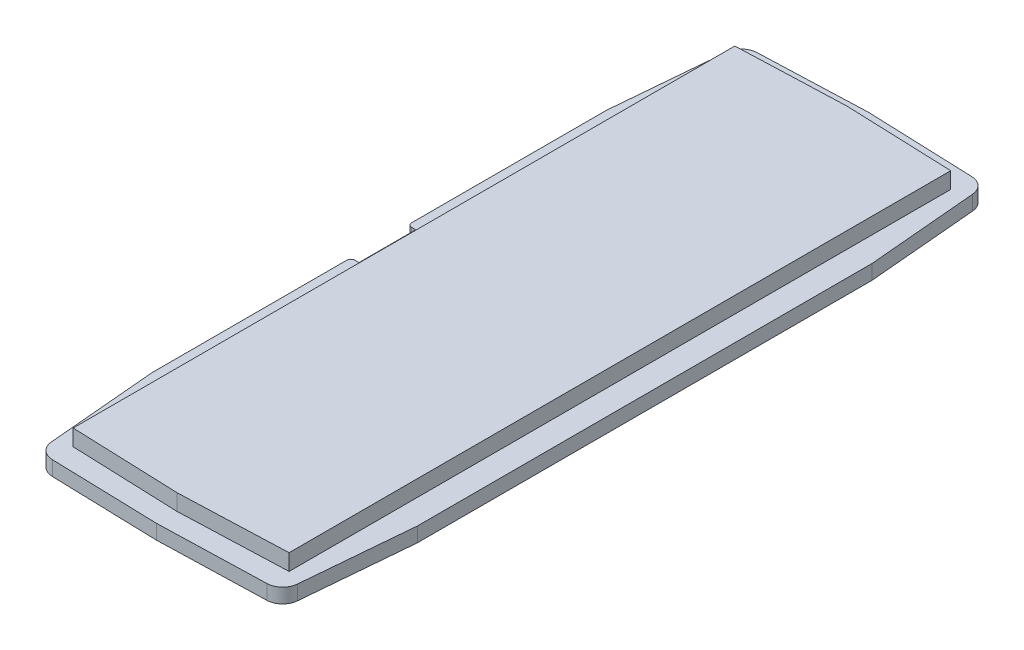
ISO-10303-21;
HEADER;
FILE_DESCRIPTION(('STEP AP214'),'2;1');
FILE_NAME('part.step','',(''),(''),'','','');
FILE_SCHEMA(('AUTOMOTIVE_DESIGN { 1 0 10303 214 1 1 1 1 }'));
ENDSEC;
DATA;
#1=APPLICATION_CONTEXT('core data for automotive mechanical design processes');
#2=APPLICATION_PROTOCOL_DEFINITION('international standard','automotive_design',2000,#1);
#3=PRODUCT_CONTEXT('',#1,'mechanical');
#4=PRODUCT('Part','Part','',(#3));
#5=PRODUCT_RELATED_PRODUCT_CATEGORY('part','',(#4));
#6=PRODUCT_DEFINITION_FORMATION('','',#4);
#7=PRODUCT_DEFINITION_CONTEXT('part definition',#1,'design');
#8=PRODUCT_DEFINITION('design','',#6,#7);
#9=PRODUCT_DEFINITION_SHAPE('','',#8);
#10=(LENGTH_UNIT() NAMED_UNIT(*) SI_UNIT(.MILLI.,.METRE.));
#11=(NAMED_UNIT(*) PLANE_ANGLE_UNIT() SI_UNIT($,.RADIAN.));
#12=(NAMED_UNIT(*) SI_UNIT($,.STERADIAN.) SOLID_ANGLE_UNIT());
#13=UNCERTAINTY_MEASURE_WITH_UNIT(LENGTH_MEASURE(1.E-05),#10,'distance_accuracy_value','');
#14=(GEOMETRIC_REPRESENTATION_CONTEXT(3) GLOBAL_UNCERTAINTY_ASSIGNED_CONTEXT((#13)) GLOBAL_UNIT_ASSIGNED_CONTEXT((#10,
#11,#12)) REPRESENTATION_CONTEXT('',''));
#15=CARTESIAN_POINT('',(0.,0.,0.));
#16=DIRECTION('',(0.,0.,1.));
#17=DIRECTION('',(1.,0.,0.));
#18=AXIS2_PLACEMENT_3D('',#15,#16,#17);
#19=CARTESIAN_POINT('',(-15.85,1.8,-4.));
#20=DIRECTION('',(0.,1.,0.));
#21=DIRECTION('',(0.,0.,1.));
#22=AXIS2_PLACEMENT_3D('',#19,#20,#21);
#23=PLANE('',#22);
#24=DIRECTION('',(0.99958153428252,0.,-0.0289267405941802));
#25=VECTOR('',#24,1.);
#26=CARTESIAN_POINT('',(0.,1.8,43.7846989275499));
#27=LINE('',#26,#25);
#28=CARTESIAN_POINT('',(0.,1.8,43.7846989275499));
#29=VERTEX_POINT('',#28);
#30=CARTESIAN_POINT('',(13.2214227765586,1.8,43.4020861502761));
#31=VERTEX_POINT('',#30);
#32=EDGE_CURVE('E267',#29,#31,#27,.T.);
#33=ORIENTED_EDGE('',*,*,#32,.T.);
#34=CARTESIAN_POINT('',(13.1635692953702,1.8,41.402923081711));
#35=DIRECTION('',(0.,1.,0.));
#36=DIRECTION('',(0.,0.,1.));
#37=AXIS2_PLACEMENT_3D('',#34,#35,#36);
#38=CIRCLE('',#37,2.);
#39=CARTESIAN_POINT('',(15.1558796625118,1.8,41.5781355269885));
#40=VERTEX_POINT('',#39);
#41=EDGE_CURVE('E375',#31,#40,#38,.T.);
#42=ORIENTED_EDGE('',*,*,#41,.T.);
#43=DIRECTION('',(0.0876062226387284,0.,-0.9961551835708));
#44=VECTOR('',#43,1.);
#45=CARTESIAN_POINT('',(15.,1.8,43.3506161698846));
#46=LINE('',#45,#44);
#47=CARTESIAN_POINT('',(16.35,1.8,28.));
#48=VERTEX_POINT('',#47);
#49=EDGE_CURVE('E270',#40,#48,#46,.T.);
#50=ORIENTED_EDGE('',*,*,#49,.T.);
#51=DIRECTION('',(0.,0.,-1.));
#52=VECTOR('',#51,1.);
#53=CARTESIAN_POINT('',(16.35,1.8,28.));
#54=LINE('',#53,#52);
#55=CARTESIAN_POINT('',(16.35,1.8,-28.));
#56=VERTEX_POINT('',#55);
#57=EDGE_CURVE('E272',#48,#56,#54,.T.);
#58=ORIENTED_EDGE('',*,*,#57,.T.);
#59=DIRECTION('',(-0.0876132083473841,0.,-0.996154569192491));
#60=VECTOR('',#59,1.);
#61=CARTESIAN_POINT('',(16.35,1.8,-28.));
#62=LINE('',#61,#60);
#63=CARTESIAN_POINT('',(15.1545183752427,1.8,-41.5925222389507));
#64=VERTEX_POINT('',#63);
#65=EDGE_CURVE('E274',#56,#64,#62,.T.);
#66=ORIENTED_EDGE('',*,*,#65,.T.);
#67=CARTESIAN_POINT('',(13.1622092368577,1.8,-41.4172958222559));
#68=DIRECTION('',(0.,1.,0.));
#69=DIRECTION('',(0.,0.,1.));
#70=AXIS2_PLACEMENT_3D('',#67,#68,#69);
#71=CIRCLE('',#70,2.);
#72=CARTESIAN_POINT('',(13.2376113695261,1.8,-43.4158739464204));
#73=VERTEX_POINT('',#72);
#74=EDGE_CURVE('E370',#64,#73,#71,.T.);
#75=ORIENTED_EDGE('',*,*,#74,.T.);
#76=DIRECTION('',(-0.999289062082271,0.,-0.0377010663341814));
#77=VECTOR('',#76,1.);
#78=CARTESIAN_POINT('',(15.,1.8,-43.3493827446398));
#79=LINE('',#78,#77);
#80=CARTESIAN_POINT('',(0.,1.8,-43.9153010724501));
#81=VERTEX_POINT('',#80);
#82=EDGE_CURVE('E277',#73,#81,#79,.T.);
#83=ORIENTED_EDGE('',*,*,#82,.T.);
#84=DIRECTION('',(-0.999289062082271,0.,0.0377010663341814));
#85=VECTOR('',#84,1.);
#86=CARTESIAN_POINT('',(0.,1.8,-43.9153010724501));
#87=LINE('',#86,#85);
#88=CARTESIAN_POINT('',(-13.2376113695261,1.8,-43.4158739464204));
#89=VERTEX_POINT('',#88);
#90=EDGE_CURVE('E279',#81,#89,#87,.T.);
#91=ORIENTED_EDGE('',*,*,#90,.T.);
#92=CARTESIAN_POINT('',(-13.1622092368577,1.8,-41.4172958222559));
#93=DIRECTION('',(0.,1.,0.));
#94=DIRECTION('',(0.,0.,1.));
#95=AXIS2_PLACEMENT_3D('',#92,#93,#94);
#96=CIRCLE('',#95,2.);
#97=CARTESIAN_POINT('',(-15.1545183752427,1.8,-41.5925222389507));
#98=VERTEX_POINT('',#97);
#99=EDGE_CURVE('E46',#89,#98,#96,.T.);
#100=ORIENTED_EDGE('',*,*,#99,.T.);
#101=DIRECTION('',(-0.0876132083473841,0.,0.996154569192491));
#102=VECTOR('',#101,1.);
#103=CARTESIAN_POINT('',(-15.,1.8,-43.3493827446398));
#104=LINE('',#103,#102);
#105=CARTESIAN_POINT('',(-16.35,1.8,-28.));
#106=VERTEX_POINT('',#105);
#107=EDGE_CURVE('E281',#98,#106,#104,.T.);
#108=ORIENTED_EDGE('',*,*,#107,.T.);
#109=DIRECTION('',(0.,0.,1.));
#110=VECTOR('',#109,1.);
#111=CARTESIAN_POINT('',(-16.35,1.8,-28.));
#112=LINE('',#111,#110);
#113=CARTESIAN_POINT('',(-16.35,1.8,-4.));
#114=VERTEX_POINT('',#113);
#115=EDGE_CURVE('E283',#106,#114,#112,.T.);
#116=ORIENTED_EDGE('',*,*,#115,.T.);
#117=CARTESIAN_POINT('',(-15.85,1.8,-4.));
#118=DIRECTION('',(0.,1.,0.));
#119=DIRECTION('',(0.,0.,1.));
#120=AXIS2_PLACEMENT_3D('',#117,#118,#119);
#121=CIRCLE('',#120,0.5);
#122=CARTESIAN_POINT('',(-15.85,1.8,-3.5));
#123=VERTEX_POINT('',#122);
#124=EDGE_CURVE('E285',#114,#123,#121,.T.);
#125=ORIENTED_EDGE('',*,*,#124,.T.);
#126=DIRECTION('',(1.,0.,0.));
#127=VECTOR('',#126,1.);
#128=CARTESIAN_POINT('',(-15.35,1.8,-3.5));
#129=LINE('',#128,#127);
#130=CARTESIAN_POINT('',(-15.35,1.8,-3.5));
#131=VERTEX_POINT('',#130);
#132=EDGE_CURVE('E250',#123,#131,#129,.T.);
#133=ORIENTED_EDGE('',*,*,#132,.T.);
#134=DIRECTION('',(0.,0.,1.));
#135=VECTOR('',#134,1.);
#136=CARTESIAN_POINT('',(-15.35,1.8,-3.5));
#137=LINE('',#136,#135);
#138=CARTESIAN_POINT('',(-15.35,1.8,3.5));
#139=VERTEX_POINT('',#138);
#140=EDGE_CURVE('E253',#131,#139,#137,.T.);
#141=ORIENTED_EDGE('',*,*,#140,.T.);
#142=DIRECTION('',(-1.,0.,0.));
#143=VECTOR('',#142,1.);
#144=CARTESIAN_POINT('',(-15.35,1.8,3.5));
#145=LINE('',#144,#143);
#146=CARTESIAN_POINT('',(-15.85,1.8,3.5));
#147=VERTEX_POINT('',#146);
#148=EDGE_CURVE('E256',#139,#147,#145,.T.);
#149=ORIENTED_EDGE('',*,*,#148,.T.);
#150=CARTESIAN_POINT('',(-15.85,1.8,4.));
#151=DIRECTION('',(0.,1.,0.));
#152=DIRECTION('',(0.,0.,-1.));
#153=AXIS2_PLACEMENT_3D('',#150,#151,#152);
#154=CIRCLE('',#153,0.5);
#155=CARTESIAN_POINT('',(-16.35,1.8,4.));
#156=VERTEX_POINT('',#155);
#157=EDGE_CURVE('E258',#147,#156,#154,.T.);
#158=ORIENTED_EDGE('',*,*,#157,.T.);
#159=DIRECTION('',(0.,0.,1.));
#160=VECTOR('',#159,1.);
#161=CARTESIAN_POINT('',(-16.35,1.8,4.));
#162=LINE('',#161,#160);
#163=CARTESIAN_POINT('',(-16.35,1.8,28.));
#164=VERTEX_POINT('',#163);
#165=EDGE_CURVE('E260',#156,#164,#162,.T.);
#166=ORIENTED_EDGE('',*,*,#165,.T.);
#167=DIRECTION('',(0.0876062226387304,0.,0.996155183570799));
#168=VECTOR('',#167,1.);
#169=CARTESIAN_POINT('',(-16.35,1.8,28.));
#170=LINE('',#169,#168);
#171=CARTESIAN_POINT('',(-15.1558796625118,1.8,41.5781355269885));
#172=VERTEX_POINT('',#171);
#173=EDGE_CURVE('E262',#164,#172,#170,.T.);
#174=ORIENTED_EDGE('',*,*,#173,.T.);
#175=CARTESIAN_POINT('',(-13.1635692953702,1.8,41.402923081711));
#176=DIRECTION('',(0.,1.,0.));
#177=DIRECTION('',(0.,0.,1.));
#178=AXIS2_PLACEMENT_3D('',#175,#176,#177);
#179=CIRCLE('',#178,2.);
#180=CARTESIAN_POINT('',(-13.2214227765585,1.8,43.4020861502761));
#181=VERTEX_POINT('',#180);
#182=EDGE_CURVE('E373',#172,#181,#179,.T.);
#183=ORIENTED_EDGE('',*,*,#182,.T.);
#184=DIRECTION('',(0.99958153428252,0.,0.0289267405941803));
#185=VECTOR('',#184,1.);
#186=CARTESIAN_POINT('',(-15.,1.8,43.3506161698846));
#187=LINE('',#186,#185);
#188=EDGE_CURVE('E265',#181,#29,#187,.T.);
#189=ORIENTED_EDGE('',*,*,#188,.T.);
#190=EDGE_LOOP('',(#33,#42,#50,#58,#66,#75,#83,#91,#100,#108,#116,#125,#133,#141,#149,#158,#166,
#174,#183,#189));
#191=FACE_BOUND('',#190,.T.);
#192=DIRECTION('',(0.,0.,-1.));
#193=VECTOR('',#192,1.);
#194=CARTESIAN_POINT('',(-13.3,1.8,-4.));
#195=LINE('',#194,#193);
#196=CARTESIAN_POINT('',(-13.3,1.8,40.75));
#197=VERTEX_POINT('',#196);
#198=CARTESIAN_POINT('',(-13.3,1.8,-40.75));
#199=VERTEX_POINT('',#198);
#200=EDGE_CURVE('E246',#197,#199,#195,.T.);
#201=ORIENTED_EDGE('',*,*,#200,.T.);
#202=DIRECTION('',(0.999294094305728,0.,-0.0375674471543507));
#203=VECTOR('',#202,1.);
#204=CARTESIAN_POINT('',(-17.2260302585526,1.8,-40.602404877498));
#205=LINE('',#204,#203);
#206=CARTESIAN_POINT('',(0.,1.8,-41.25));
#207=VERTEX_POINT('',#206);
#208=EDGE_CURVE('E228',#199,#207,#205,.T.);
#209=ORIENTED_EDGE('',*,*,#208,.T.);
#210=DIRECTION('',(0.999294094305728,0.,0.0375674471543507));
#211=VECTOR('',#210,1.);
#212=CARTESIAN_POINT('',(-14.4292311166309,1.8,-41.7924522976177));
#213=LINE('',#212,#211);
#214=CARTESIAN_POINT('',(13.3,1.8,-40.75));
#215=VERTEX_POINT('',#214);
#216=EDGE_CURVE('E229',#207,#215,#213,.T.);
#217=ORIENTED_EDGE('',*,*,#216,.T.);
#218=DIRECTION('',(0.,0.,1.));
#219=VECTOR('',#218,1.);
#220=CARTESIAN_POINT('',(13.3,1.8,-4.));
#221=LINE('',#220,#219);
#222=CARTESIAN_POINT('',(13.3,1.8,40.75));
#223=VERTEX_POINT('',#222);
#224=EDGE_CURVE('E232',#215,#223,#221,.T.);
#225=ORIENTED_EDGE('',*,*,#224,.T.);
#226=DIRECTION('',(-0.999294094305728,0.,0.0375674471543507));
#227=VECTOR('',#226,1.);
#228=CARTESIAN_POINT('',(-14.128903691995,1.8,41.7811617929321));
#229=LINE('',#228,#227);
#230=CARTESIAN_POINT('',(0.,1.8,41.25));
#231=VERTEX_POINT('',#230);
#232=EDGE_CURVE('E240',#223,#231,#229,.T.);
#233=ORIENTED_EDGE('',*,*,#232,.T.);
#234=DIRECTION('',(-0.999294094305728,0.,-0.0375674471543507));
#235=VECTOR('',#234,1.);
#236=CARTESIAN_POINT('',(-17.5263576831884,1.8,40.5911143728125));
#237=LINE('',#236,#235);
#238=EDGE_CURVE('E243',#231,#197,#237,.T.);
#239=ORIENTED_EDGE('',*,*,#238,.T.);
#240=EDGE_LOOP('',(#201,#209,#217,#225,#233,#239));
#241=FACE_BOUND('',#240,.T.);
#242=ADVANCED_FACE('F31',(#191,#241),#23,.T.);
#243=CARTESIAN_POINT('',(-15.35,1.8,-3.5));
#244=DIRECTION('',(0.,0.,-1.));
#245=DIRECTION('',(-1.,0.,0.));
#246=AXIS2_PLACEMENT_3D('',#243,#244,#245);
#247=PLANE('',#246);
#248=DIRECTION('',(1.,0.,0.));
#249=VECTOR('',#248,1.);
#250=CARTESIAN_POINT('',(-15.35,0.,-3.5));
#251=LINE('',#250,#249);
#252=CARTESIAN_POINT('',(-15.85,0.,-3.5));
#253=VERTEX_POINT('',#252);
#254=CARTESIAN_POINT('',(-15.35,0.,-3.5));
#255=VERTEX_POINT('',#254);
#256=EDGE_CURVE('E249',#253,#255,#251,.T.);
#257=ORIENTED_EDGE('',*,*,#256,.T.);
#258=DIRECTION('',(0.,-1.,0.));
#259=VECTOR('',#258,1.);
#260=CARTESIAN_POINT('',(-15.35,1.8,-3.5));
#261=LINE('',#260,#259);
#262=EDGE_CURVE('E354',#131,#255,#261,.T.);
#263=ORIENTED_EDGE('',*,*,#262,.F.);
#264=ORIENTED_EDGE('',*,*,#132,.F.);
#265=DIRECTION('',(0.,-1.,0.));
#266=VECTOR('',#265,1.);
#267=CARTESIAN_POINT('',(-15.85,1.8,-3.5));
#268=LINE('',#267,#266);
#269=EDGE_CURVE('E287',#123,#253,#268,.T.);
#270=ORIENTED_EDGE('',*,*,#269,.T.);
#271=EDGE_LOOP('',(#257,#263,#264,#270));
#272=FACE_BOUND('',#271,.T.);
#273=ADVANCED_FACE('F423',(#272),#247,.F.);
#274=CARTESIAN_POINT('',(-15.35,1.8,-3.5));
#275=DIRECTION('',(1.,0.,0.));
#276=DIRECTION('',(0.,0.,-1.));
#277=AXIS2_PLACEMENT_3D('',#274,#275,#276);
#278=PLANE('',#277);
#279=DIRECTION('',(0.,0.,1.));
#280=VECTOR('',#279,1.);
#281=CARTESIAN_POINT('',(-15.35,0.,-3.5));
#282=LINE('',#281,#280);
#283=CARTESIAN_POINT('',(-15.35,0.,3.5));
#284=VERTEX_POINT('',#283);
#285=EDGE_CURVE('E290',#255,#284,#282,.T.);
#286=ORIENTED_EDGE('',*,*,#285,.T.);
#287=DIRECTION('',(0.,-1.,0.));
#288=VECTOR('',#287,1.);
#289=CARTESIAN_POINT('',(-15.35,1.8,3.5));
#290=LINE('',#289,#288);
#291=EDGE_CURVE('E351',#139,#284,#290,.T.);
#292=ORIENTED_EDGE('',*,*,#291,.F.);
#293=ORIENTED_EDGE('',*,*,#140,.F.);
#294=ORIENTED_EDGE('',*,*,#262,.T.);
#295=EDGE_LOOP('',(#286,#292,#293,#294));
#296=FACE_BOUND('',#295,.T.);
#297=ADVANCED_FACE('F425',(#296),#278,.F.);
#298=CARTESIAN_POINT('',(-15.35,1.8,3.5));
#299=DIRECTION('',(0.,0.,1.));
#300=DIRECTION('',(1.,0.,0.));
#301=AXIS2_PLACEMENT_3D('',#298,#299,#300);
#302=PLANE('',#301);
#303=DIRECTION('',(-1.,0.,0.));
#304=VECTOR('',#303,1.);
#305=CARTESIAN_POINT('',(-15.35,0.,3.5));
#306=LINE('',#305,#304);
#307=CARTESIAN_POINT('',(-15.85,0.,3.5));
#308=VERTEX_POINT('',#307);
#309=EDGE_CURVE('E292',#284,#308,#306,.T.);
#310=ORIENTED_EDGE('',*,*,#309,.T.);
#311=DIRECTION('',(0.,-1.,0.));
#312=VECTOR('',#311,1.);
#313=CARTESIAN_POINT('',(-15.85,1.8,3.5));
#314=LINE('',#313,#312);
#315=EDGE_CURVE('E348',#147,#308,#314,.T.);
#316=ORIENTED_EDGE('',*,*,#315,.F.);
#317=ORIENTED_EDGE('',*,*,#148,.F.);
#318=ORIENTED_EDGE('',*,*,#291,.T.);
#319=EDGE_LOOP('',(#310,#316,#317,#318));
#320=FACE_BOUND('',#319,.T.);
#321=ADVANCED_FACE('F430',(#320),#302,.F.);
#322=CARTESIAN_POINT('',(-15.85,1.8,4.));
#323=DIRECTION('',(0.,-1.,0.));
#324=DIRECTION('',(0.,0.,-1.));
#325=AXIS2_PLACEMENT_3D('',#322,#323,#324);
#326=CYLINDRICAL_SURFACE('',#325,0.5);
#327=CARTESIAN_POINT('',(-15.85,0.,4.));
#328=DIRECTION('',(0.,1.,0.));
#329=DIRECTION('',(0.,0.,-1.));
#330=AXIS2_PLACEMENT_3D('',#327,#328,#329);
#331=CIRCLE('',#330,0.5);
#332=CARTESIAN_POINT('',(-16.35,0.,4.));
#333=VERTEX_POINT('',#332);
#334=EDGE_CURVE('E294',#308,#333,#331,.T.);
#335=ORIENTED_EDGE('',*,*,#334,.T.);
#336=DIRECTION('',(0.,-1.,0.));
#337=VECTOR('',#336,1.);
#338=CARTESIAN_POINT('',(-16.35,1.8,4.));
#339=LINE('',#338,#337);
#340=EDGE_CURVE('E345',#156,#333,#339,.T.);
#341=ORIENTED_EDGE('',*,*,#340,.F.);
#342=ORIENTED_EDGE('',*,*,#157,.F.);
#343=ORIENTED_EDGE('',*,*,#315,.T.);
#344=EDGE_LOOP('',(#335,#341,#342,#343));
#345=FACE_BOUND('',#344,.T.);
#346=ADVANCED_FACE('F436',(#345),#326,.T.);
#347=CARTESIAN_POINT('',(-16.35,1.8,4.));
#348=DIRECTION('',(1.,0.,0.));
#349=DIRECTION('',(0.,0.,-1.));
#350=AXIS2_PLACEMENT_3D('',#347,#348,#349);
#351=PLANE('',#350);
#352=DIRECTION('',(0.,0.,1.));
#353=VECTOR('',#352,1.);
#354=CARTESIAN_POINT('',(-16.35,0.,4.));
#355=LINE('',#354,#353);
#356=CARTESIAN_POINT('',(-16.35,0.,28.));
#357=VERTEX_POINT('',#356);
#358=EDGE_CURVE('E296',#333,#357,#355,.T.);
#359=ORIENTED_EDGE('',*,*,#358,.T.);
#360=DIRECTION('',(0.,-1.,0.));
#361=VECTOR('',#360,1.);
#362=CARTESIAN_POINT('',(-16.35,1.8,28.));
#363=LINE('',#362,#361);
#364=EDGE_CURVE('E342',#164,#357,#363,.T.);
#365=ORIENTED_EDGE('',*,*,#364,.F.);
#366=ORIENTED_EDGE('',*,*,#165,.F.);
#367=ORIENTED_EDGE('',*,*,#340,.T.);
#368=EDGE_LOOP('',(#359,#365,#366,#367));
#369=FACE_BOUND('',#368,.T.);
#370=ADVANCED_FACE('F440',(#369),#351,.F.);
#371=CARTESIAN_POINT('',(-16.35,1.8,28.));
#372=DIRECTION('',(0.996155183570799,0.,-0.0876062226387304));
#373=DIRECTION('',(-0.0876062226387304,0.,-0.996155183570799));
#374=AXIS2_PLACEMENT_3D('',#371,#372,#373);
#375=PLANE('',#374);
#376=DIRECTION('',(0.0876062226387304,0.,0.996155183570799));
#377=VECTOR('',#376,1.);
#378=CARTESIAN_POINT('',(-16.35,0.,28.));
#379=LINE('',#378,#377);
#380=CARTESIAN_POINT('',(-15.1558796625118,0.,41.5781355269885));
#381=VERTEX_POINT('',#380);
#382=EDGE_CURVE('E298',#357,#381,#379,.T.);
#383=ORIENTED_EDGE('',*,*,#382,.T.);
#384=DIRECTION('',(0.,-1.,0.));
#385=VECTOR('',#384,1.);
#386=CARTESIAN_POINT('',(-15.1558796625118,1.8,41.5781355269885));
#387=LINE('',#386,#385);
#388=EDGE_CURVE('E380',#381,#172,#387,.F.);
#389=ORIENTED_EDGE('',*,*,#388,.T.);
#390=ORIENTED_EDGE('',*,*,#173,.F.);
#391=ORIENTED_EDGE('',*,*,#364,.T.);
#392=EDGE_LOOP('',(#383,#389,#390,#391));
#393=FACE_BOUND('',#392,.T.);
#394=ADVANCED_FACE('F444',(#393),#375,.F.);
#395=CARTESIAN_POINT('',(-15.,1.8,43.3506161698846));
#396=DIRECTION('',(0.0289267405941803,0.,-0.99958153428252));
#397=DIRECTION('',(-0.99958153428252,0.,-0.0289267405941803));
#398=AXIS2_PLACEMENT_3D('',#395,#396,#397);
#399=PLANE('',#398);
#400=ORIENTED_EDGE('',*,*,#188,.F.);
#401=DIRECTION('',(0.,-1.,0.));
#402=VECTOR('',#401,1.);
#403=CARTESIAN_POINT('',(-13.2214227765585,1.8,43.4020861502761));
#404=LINE('',#403,#402);
#405=CARTESIAN_POINT('',(-13.2214227765585,0.,43.4020861502761));
#406=VERTEX_POINT('',#405);
#407=EDGE_CURVE('E377',#181,#406,#404,.T.);
#408=ORIENTED_EDGE('',*,*,#407,.T.);
#409=DIRECTION('',(0.99958153428252,0.,0.0289267405941803));
#410=VECTOR('',#409,1.);
#411=CARTESIAN_POINT('',(-15.,0.,43.3506161698846));
#412=LINE('',#411,#410);
#413=CARTESIAN_POINT('',(0.,0.,43.7846989275499));
#414=VERTEX_POINT('',#413);
#415=EDGE_CURVE('E301',#406,#414,#412,.T.);
#416=ORIENTED_EDGE('',*,*,#415,.T.);
#417=DIRECTION('',(0.,-1.,0.));
#418=VECTOR('',#417,1.);
#419=CARTESIAN_POINT('',(0.,1.8,43.7846989275499));
#420=LINE('',#419,#418);
#421=EDGE_CURVE('E339',#29,#414,#420,.T.);
#422=ORIENTED_EDGE('',*,*,#421,.F.);
#423=EDGE_LOOP('',(#400,#408,#416,#422));
#424=FACE_BOUND('',#423,.T.);
#425=ADVANCED_FACE('F453',(#424),#399,.F.);
#426=CARTESIAN_POINT('',(0.,1.8,43.7846989275499));
#427=DIRECTION('',(-0.0289267405941802,0.,-0.99958153428252));
#428=DIRECTION('',(-0.99958153428252,0.,0.0289267405941802));
#429=AXIS2_PLACEMENT_3D('',#426,#427,#428);
#430=PLANE('',#429);
#431=DIRECTION('',(0.99958153428252,0.,-0.0289267405941802));
#432=VECTOR('',#431,1.);
#433=CARTESIAN_POINT('',(0.,0.,43.7846989275499));
#434=LINE('',#433,#432);
#435=CARTESIAN_POINT('',(13.2214227765586,0.,43.4020861502761));
#436=VERTEX_POINT('',#435);
#437=EDGE_CURVE('E303',#414,#436,#434,.T.);
#438=ORIENTED_EDGE('',*,*,#437,.T.);
#439=DIRECTION('',(0.,-1.,0.));
#440=VECTOR('',#439,1.);
#441=CARTESIAN_POINT('',(13.2214227765586,1.8,43.4020861502761));
#442=LINE('',#441,#440);
#443=EDGE_CURVE('E368',#436,#31,#442,.F.);
#444=ORIENTED_EDGE('',*,*,#443,.T.);
#445=ORIENTED_EDGE('',*,*,#32,.F.);
#446=ORIENTED_EDGE('',*,*,#421,.T.);
#447=EDGE_LOOP('',(#438,#444,#445,#446));
#448=FACE_BOUND('',#447,.T.);
#449=ADVANCED_FACE('F458',(#448),#430,.F.);
#450=CARTESIAN_POINT('',(15.,1.8,43.3506161698846));
#451=DIRECTION('',(-0.9961551835708,0.,-0.0876062226387284));
#452=DIRECTION('',(-0.0876062226387284,0.,0.9961551835708));
#453=AXIS2_PLACEMENT_3D('',#450,#451,#452);
#454=PLANE('',#453);
#455=ORIENTED_EDGE('',*,*,#49,.F.);
#456=DIRECTION('',(0.,-1.,0.));
#457=VECTOR('',#456,1.);
#458=CARTESIAN_POINT('',(15.1558796625118,1.8,41.5781355269885));
#459=LINE('',#458,#457);
#460=CARTESIAN_POINT('',(15.1558796625118,0.,41.5781355269885));
#461=VERTEX_POINT('',#460);
#462=EDGE_CURVE('E357',#40,#461,#459,.T.);
#463=ORIENTED_EDGE('',*,*,#462,.T.);
#464=DIRECTION('',(0.0876062226387284,0.,-0.9961551835708));
#465=VECTOR('',#464,1.);
#466=CARTESIAN_POINT('',(15.,0.,43.3506161698846));
#467=LINE('',#466,#465);
#468=CARTESIAN_POINT('',(16.35,0.,28.));
#469=VERTEX_POINT('',#468);
#470=EDGE_CURVE('E306',#461,#469,#467,.T.);
#471=ORIENTED_EDGE('',*,*,#470,.T.);
#472=DIRECTION('',(0.,-1.,0.));
#473=VECTOR('',#472,1.);
#474=CARTESIAN_POINT('',(16.35,1.8,28.));
#475=LINE('',#474,#473);
#476=EDGE_CURVE('E336',#48,#469,#475,.T.);
#477=ORIENTED_EDGE('',*,*,#476,.F.);
#478=EDGE_LOOP('',(#455,#463,#471,#477));
#479=FACE_BOUND('',#478,.T.);
#480=ADVANCED_FACE('F467',(#479),#454,.F.);
#481=CARTESIAN_POINT('',(16.35,1.8,28.));
#482=DIRECTION('',(-1.,0.,0.));
#483=DIRECTION('',(0.,0.,1.));
#484=AXIS2_PLACEMENT_3D('',#481,#482,#483);
#485=PLANE('',#484);
#486=DIRECTION('',(0.,0.,-1.));
#487=VECTOR('',#486,1.);
#488=CARTESIAN_POINT('',(16.35,0.,28.));
#489=LINE('',#488,#487);
#490=CARTESIAN_POINT('',(16.35,0.,-28.));
#491=VERTEX_POINT('',#490);
#492=EDGE_CURVE('E308',#469,#491,#489,.T.);
#493=ORIENTED_EDGE('',*,*,#492,.T.);
#494=DIRECTION('',(0.,-1.,0.));
#495=VECTOR('',#494,1.);
#496=CARTESIAN_POINT('',(16.35,1.8,-28.));
#497=LINE('',#496,#495);
#498=EDGE_CURVE('E333',#56,#491,#497,.T.);
#499=ORIENTED_EDGE('',*,*,#498,.F.);
#500=ORIENTED_EDGE('',*,*,#57,.F.);
#501=ORIENTED_EDGE('',*,*,#476,.T.);
#502=EDGE_LOOP('',(#493,#499,#500,#501));
#503=FACE_BOUND('',#502,.T.);
#504=ADVANCED_FACE('F472',(#503),#485,.F.);
#505=CARTESIAN_POINT('',(16.35,1.8,-28.));
#506=DIRECTION('',(-0.996154569192491,0.,0.0876132083473841));
#507=DIRECTION('',(0.0876132083473841,0.,0.996154569192491));
#508=AXIS2_PLACEMENT_3D('',#505,#506,#507);
#509=PLANE('',#508);
#510=DIRECTION('',(-0.0876132083473841,0.,-0.996154569192491));
#511=VECTOR('',#510,1.);
#512=CARTESIAN_POINT('',(16.35,0.,-28.));
#513=LINE('',#512,#511);
#514=CARTESIAN_POINT('',(15.1545183752427,0.,-41.5925222389507));
#515=VERTEX_POINT('',#514);
#516=EDGE_CURVE('E310',#491,#515,#513,.T.);
#517=ORIENTED_EDGE('',*,*,#516,.T.);
#518=DIRECTION('',(0.,-1.,0.));
#519=VECTOR('',#518,1.);
#520=CARTESIAN_POINT('',(15.1545183752427,1.8,-41.5925222389507));
#521=LINE('',#520,#519);
#522=EDGE_CURVE('E11',#515,#64,#521,.F.);
#523=ORIENTED_EDGE('',*,*,#522,.T.);
#524=ORIENTED_EDGE('',*,*,#65,.F.);
#525=ORIENTED_EDGE('',*,*,#498,.T.);
#526=EDGE_LOOP('',(#517,#523,#524,#525));
#527=FACE_BOUND('',#526,.T.);
#528=ADVANCED_FACE('F476',(#527),#509,.F.);
#529=CARTESIAN_POINT('',(15.,1.8,-43.3493827446398));
#530=DIRECTION('',(-0.0377010663341814,0.,0.999289062082271));
#531=DIRECTION('',(0.999289062082272,0.,0.0377010663341814));
#532=AXIS2_PLACEMENT_3D('',#529,#530,#531);
#533=PLANE('',#532);
#534=ORIENTED_EDGE('',*,*,#82,.F.);
#535=DIRECTION('',(0.,-1.,0.));
#536=VECTOR('',#535,1.);
#537=CARTESIAN_POINT('',(13.2376113695261,1.8,-43.4158739464204));
#538=LINE('',#537,#536);
#539=CARTESIAN_POINT('',(13.2376113695261,0.,-43.4158739464204));
#540=VERTEX_POINT('',#539);
#541=EDGE_CURVE('E39',#73,#540,#538,.T.);
#542=ORIENTED_EDGE('',*,*,#541,.T.);
#543=DIRECTION('',(-0.999289062082271,0.,-0.0377010663341814));
#544=VECTOR('',#543,1.);
#545=CARTESIAN_POINT('',(15.,0.,-43.3493827446398));
#546=LINE('',#545,#544);
#547=CARTESIAN_POINT('',(0.,0.,-43.9153010724501));
#548=VERTEX_POINT('',#547);
#549=EDGE_CURVE('E313',#540,#548,#546,.T.);
#550=ORIENTED_EDGE('',*,*,#549,.T.);
#551=DIRECTION('',(0.,-1.,0.));
#552=VECTOR('',#551,1.);
#553=CARTESIAN_POINT('',(0.,1.8,-43.9153010724501));
#554=LINE('',#553,#552);
#555=EDGE_CURVE('E330',#81,#548,#554,.T.);
#556=ORIENTED_EDGE('',*,*,#555,.F.);
#557=EDGE_LOOP('',(#534,#542,#550,#556));
#558=FACE_BOUND('',#557,.T.);
#559=ADVANCED_FACE('F390',(#558),#533,.F.);
#560=CARTESIAN_POINT('',(0.,1.8,-43.9153010724501));
#561=DIRECTION('',(0.0377010663341814,0.,0.999289062082271));
#562=DIRECTION('',(0.999289062082272,0.,-0.0377010663341814));
#563=AXIS2_PLACEMENT_3D('',#560,#561,#562);
#564=PLANE('',#563);
#565=DIRECTION('',(-0.999289062082271,0.,0.0377010663341814));
#566=VECTOR('',#565,1.);
#567=CARTESIAN_POINT('',(0.,0.,-43.9153010724501));
#568=LINE('',#567,#566);
#569=CARTESIAN_POINT('',(-13.2376113695261,0.,-43.4158739464204));
#570=VERTEX_POINT('',#569);
#571=EDGE_CURVE('E315',#548,#570,#568,.T.);
#572=ORIENTED_EDGE('',*,*,#571,.T.);
#573=DIRECTION('',(0.,-1.,0.));
#574=VECTOR('',#573,1.);
#575=CARTESIAN_POINT('',(-13.2376113695261,1.8,-43.4158739464204));
#576=LINE('',#575,#574);
#577=EDGE_CURVE('E54',#570,#89,#576,.F.);
#578=ORIENTED_EDGE('',*,*,#577,.T.);
#579=ORIENTED_EDGE('',*,*,#90,.F.);
#580=ORIENTED_EDGE('',*,*,#555,.T.);
#581=EDGE_LOOP('',(#572,#578,#579,#580));
#582=FACE_BOUND('',#581,.T.);
#583=ADVANCED_FACE('F400',(#582),#564,.F.);
#584=CARTESIAN_POINT('',(-15.,1.8,-43.3493827446398));
#585=DIRECTION('',(0.996154569192491,0.,0.0876132083473841));
#586=DIRECTION('',(0.0876132083473841,0.,-0.996154569192491));
#587=AXIS2_PLACEMENT_3D('',#584,#585,#586);
#588=PLANE('',#587);
#589=ORIENTED_EDGE('',*,*,#107,.F.);
#590=DIRECTION('',(0.,-1.,0.));
#591=VECTOR('',#590,1.);
#592=CARTESIAN_POINT('',(-15.1545183752427,1.8,-41.5925222389507));
#593=LINE('',#592,#591);
#594=CARTESIAN_POINT('',(-15.1545183752427,0.,-41.5925222389507));
#595=VERTEX_POINT('',#594);
#596=EDGE_CURVE('E382',#98,#595,#593,.T.);
#597=ORIENTED_EDGE('',*,*,#596,.T.);
#598=DIRECTION('',(-0.0876132083473841,0.,0.996154569192491));
#599=VECTOR('',#598,1.);
#600=CARTESIAN_POINT('',(-15.,0.,-43.3493827446398));
#601=LINE('',#600,#599);
#602=CARTESIAN_POINT('',(-16.35,0.,-28.));
#603=VERTEX_POINT('',#602);
#604=EDGE_CURVE('E317',#595,#603,#601,.T.);
#605=ORIENTED_EDGE('',*,*,#604,.T.);
#606=DIRECTION('',(0.,-1.,0.));
#607=VECTOR('',#606,1.);
#608=CARTESIAN_POINT('',(-16.35,1.8,-28.));
#609=LINE('',#608,#607);
#610=EDGE_CURVE('E327',#106,#603,#609,.T.);
#611=ORIENTED_EDGE('',*,*,#610,.F.);
#612=EDGE_LOOP('',(#589,#597,#605,#611));
#613=FACE_BOUND('',#612,.T.);
#614=ADVANCED_FACE('F405',(#613),#588,.F.);
#615=CARTESIAN_POINT('',(-16.35,1.8,-28.));
#616=DIRECTION('',(1.,0.,0.));
#617=DIRECTION('',(0.,0.,-1.));
#618=AXIS2_PLACEMENT_3D('',#615,#616,#617);
#619=PLANE('',#618);
#620=DIRECTION('',(0.,0.,1.));
#621=VECTOR('',#620,1.);
#622=CARTESIAN_POINT('',(-16.35,0.,-28.));
#623=LINE('',#622,#621);
#624=CARTESIAN_POINT('',(-16.35,0.,-4.));
#625=VERTEX_POINT('',#624);
#626=EDGE_CURVE('E319',#603,#625,#623,.T.);
#627=ORIENTED_EDGE('',*,*,#626,.T.);
#628=DIRECTION('',(0.,-1.,0.));
#629=VECTOR('',#628,1.);
#630=CARTESIAN_POINT('',(-16.35,1.8,-4.));
#631=LINE('',#630,#629);
#632=EDGE_CURVE('E324',#114,#625,#631,.T.);
#633=ORIENTED_EDGE('',*,*,#632,.F.);
#634=ORIENTED_EDGE('',*,*,#115,.F.);
#635=ORIENTED_EDGE('',*,*,#610,.T.);
#636=EDGE_LOOP('',(#627,#633,#634,#635));
#637=FACE_BOUND('',#636,.T.);
#638=ADVANCED_FACE('F412',(#637),#619,.F.);
#639=CARTESIAN_POINT('',(-15.85,1.8,-4.));
#640=DIRECTION('',(0.,-1.,0.));
#641=DIRECTION('',(0.,0.,-1.));
#642=AXIS2_PLACEMENT_3D('',#639,#640,#641);
#643=CYLINDRICAL_SURFACE('',#642,0.5);
#644=CARTESIAN_POINT('',(-15.85,0.,-4.));
#645=DIRECTION('',(0.,1.,0.));
#646=DIRECTION('',(0.,0.,1.));
#647=AXIS2_PLACEMENT_3D('',#644,#645,#646);
#648=CIRCLE('',#647,0.5);
#649=EDGE_CURVE('E254',#625,#253,#648,.T.);
#650=ORIENTED_EDGE('',*,*,#649,.T.);
#651=ORIENTED_EDGE('',*,*,#269,.F.);
#652=ORIENTED_EDGE('',*,*,#124,.F.);
#653=ORIENTED_EDGE('',*,*,#632,.T.);
#654=EDGE_LOOP('',(#650,#651,#652,#653));
#655=FACE_BOUND('',#654,.T.);
#656=ADVANCED_FACE('F416',(#655),#643,.T.);
#657=CARTESIAN_POINT('',(-15.85,0.,-4.));
#658=DIRECTION('',(0.,1.,0.));
#659=DIRECTION('',(0.,0.,1.));
#660=AXIS2_PLACEMENT_3D('',#657,#658,#659);
#661=PLANE('',#660);
#662=ORIENTED_EDGE('',*,*,#470,.F.);
#663=CARTESIAN_POINT('',(13.1635692953702,0.,41.402923081711));
#664=DIRECTION('',(0.,1.,0.));
#665=DIRECTION('',(0.,0.,1.));
#666=AXIS2_PLACEMENT_3D('',#663,#664,#665);
#667=CIRCLE('',#666,2.);
#668=EDGE_CURVE('E366',#461,#436,#667,.F.);
#669=ORIENTED_EDGE('',*,*,#668,.T.);
#670=ORIENTED_EDGE('',*,*,#437,.F.);
#671=ORIENTED_EDGE('',*,*,#415,.F.);
#672=CARTESIAN_POINT('',(-13.1635692953702,0.,41.402923081711));
#673=DIRECTION('',(0.,1.,0.));
#674=DIRECTION('',(0.,0.,1.));
#675=AXIS2_PLACEMENT_3D('',#672,#673,#674);
#676=CIRCLE('',#675,2.);
#677=EDGE_CURVE('E364',#406,#381,#676,.F.);
#678=ORIENTED_EDGE('',*,*,#677,.T.);
#679=ORIENTED_EDGE('',*,*,#382,.F.);
#680=ORIENTED_EDGE('',*,*,#358,.F.);
#681=ORIENTED_EDGE('',*,*,#334,.F.);
#682=ORIENTED_EDGE('',*,*,#309,.F.);
#683=ORIENTED_EDGE('',*,*,#285,.F.);
#684=ORIENTED_EDGE('',*,*,#256,.F.);
#685=ORIENTED_EDGE('',*,*,#649,.F.);
#686=ORIENTED_EDGE('',*,*,#626,.F.);
#687=ORIENTED_EDGE('',*,*,#604,.F.);
#688=CARTESIAN_POINT('',(-13.1622092368577,0.,-41.4172958222559));
#689=DIRECTION('',(0.,1.,0.));
#690=DIRECTION('',(0.,0.,1.));
#691=AXIS2_PLACEMENT_3D('',#688,#689,#690);
#692=CIRCLE('',#691,2.);
#693=EDGE_CURVE('E362',#595,#570,#692,.F.);
#694=ORIENTED_EDGE('',*,*,#693,.T.);
#695=ORIENTED_EDGE('',*,*,#571,.F.);
#696=ORIENTED_EDGE('',*,*,#549,.F.);
#697=CARTESIAN_POINT('',(13.1622092368577,0.,-41.4172958222559));
#698=DIRECTION('',(0.,1.,0.));
#699=DIRECTION('',(0.,0.,1.));
#700=AXIS2_PLACEMENT_3D('',#697,#698,#699);
#701=CIRCLE('',#700,2.);
#702=EDGE_CURVE('E360',#540,#515,#701,.F.);
#703=ORIENTED_EDGE('',*,*,#702,.T.);
#704=ORIENTED_EDGE('',*,*,#516,.F.);
#705=ORIENTED_EDGE('',*,*,#492,.F.);
#706=EDGE_LOOP('',(#662,#669,#670,#671,#678,#679,#680,#681,#682,#683,#684,#685,#686,#687,#694,
#695,#696,#703,#704,#705));
#707=FACE_BOUND('',#706,.T.);
#708=ADVANCED_FACE('F397',(#707),#661,.F.);
#709=CARTESIAN_POINT('',(0.,3.8,-41.25));
#710=DIRECTION('',(0.0375674471543507,0.,0.999294094305728));
#711=DIRECTION('',(0.999294094305728,0.,-0.0375674471543507));
#712=AXIS2_PLACEMENT_3D('',#709,#710,#711);
#713=PLANE('',#712);
#714=ORIENTED_EDGE('',*,*,#208,.F.);
#715=DIRECTION('',(0.,-1.,0.));
#716=VECTOR('',#715,1.);
#717=CARTESIAN_POINT('',(-13.3,3.8,-40.75));
#718=LINE('',#717,#716);
#719=CARTESIAN_POINT('',(-13.3,3.8,-40.75));
#720=VERTEX_POINT('',#719);
#721=EDGE_CURVE('E209',#720,#199,#718,.T.);
#722=ORIENTED_EDGE('',*,*,#721,.F.);
#723=DIRECTION('',(-0.999294094305728,0.,0.0375674471543507));
#724=VECTOR('',#723,1.);
#725=CARTESIAN_POINT('',(0.,3.8,-41.25));
#726=LINE('',#725,#724);
#727=CARTESIAN_POINT('',(0.,3.8,-41.25));
#728=VERTEX_POINT('',#727);
#729=EDGE_CURVE('E216',#728,#720,#726,.T.);
#730=ORIENTED_EDGE('',*,*,#729,.F.);
#731=DIRECTION('',(0.,-1.,0.));
#732=VECTOR('',#731,1.);
#733=CARTESIAN_POINT('',(0.,3.8,-41.25));
#734=LINE('',#733,#732);
#735=EDGE_CURVE('E715',#728,#207,#734,.T.);
#736=ORIENTED_EDGE('',*,*,#735,.T.);
#737=EDGE_LOOP('',(#714,#722,#730,#736));
#738=FACE_BOUND('',#737,.T.);
#739=ADVANCED_FACE('F226',(#738),#713,.F.);
#740=CARTESIAN_POINT('',(-13.3,3.8,-40.75));
#741=DIRECTION('',(1.,0.,0.));
#742=DIRECTION('',(0.,0.,-1.));
#743=AXIS2_PLACEMENT_3D('',#740,#741,#742);
#744=PLANE('',#743);
#745=ORIENTED_EDGE('',*,*,#200,.F.);
#746=DIRECTION('',(0.,-1.,0.));
#747=VECTOR('',#746,1.);
#748=CARTESIAN_POINT('',(-13.3,3.8,40.75));
#749=LINE('',#748,#747);
#750=CARTESIAN_POINT('',(-13.3,3.8,40.75));
#751=VERTEX_POINT('',#750);
#752=EDGE_CURVE('E212',#751,#197,#749,.T.);
#753=ORIENTED_EDGE('',*,*,#752,.F.);
#754=DIRECTION('',(0.,0.,1.));
#755=VECTOR('',#754,1.);
#756=CARTESIAN_POINT('',(-13.3,3.8,-40.75));
#757=LINE('',#756,#755);
#758=EDGE_CURVE('E205',#720,#751,#757,.T.);
#759=ORIENTED_EDGE('',*,*,#758,.F.);
#760=ORIENTED_EDGE('',*,*,#721,.T.);
#761=EDGE_LOOP('',(#745,#753,#759,#760));
#762=FACE_BOUND('',#761,.T.);
#763=ADVANCED_FACE('F207',(#762),#744,.F.);
#764=CARTESIAN_POINT('',(-13.3,3.8,40.75));
#765=DIRECTION('',(0.0375674471543507,0.,-0.999294094305728));
#766=DIRECTION('',(-0.999294094305728,0.,-0.0375674471543507));
#767=AXIS2_PLACEMENT_3D('',#764,#765,#766);
#768=PLANE('',#767);
#769=ORIENTED_EDGE('',*,*,#238,.F.);
#770=DIRECTION('',(0.,-1.,0.));
#771=VECTOR('',#770,1.);
#772=CARTESIAN_POINT('',(0.,3.8,41.25));
#773=LINE('',#772,#771);
#774=CARTESIAN_POINT('',(0.,3.8,41.25));
#775=VERTEX_POINT('',#774);
#776=EDGE_CURVE('E234',#775,#231,#773,.T.);
#777=ORIENTED_EDGE('',*,*,#776,.F.);
#778=DIRECTION('',(0.999294094305728,0.,0.0375674471543507));
#779=VECTOR('',#778,1.);
#780=CARTESIAN_POINT('',(-13.3,3.8,40.75));
#781=LINE('',#780,#779);
#782=EDGE_CURVE('E215',#751,#775,#781,.T.);
#783=ORIENTED_EDGE('',*,*,#782,.F.);
#784=ORIENTED_EDGE('',*,*,#752,.T.);
#785=EDGE_LOOP('',(#769,#777,#783,#784));
#786=FACE_BOUND('',#785,.T.);
#787=ADVANCED_FACE('F536',(#786),#768,.F.);
#788=CARTESIAN_POINT('',(0.,3.8,41.25));
#789=DIRECTION('',(-0.0375674471543507,0.,-0.999294094305728));
#790=DIRECTION('',(-0.999294094305728,0.,0.0375674471543507));
#791=AXIS2_PLACEMENT_3D('',#788,#789,#790);
#792=PLANE('',#791);
#793=ORIENTED_EDGE('',*,*,#232,.F.);
#794=DIRECTION('',(0.,-1.,0.));
#795=VECTOR('',#794,1.);
#796=CARTESIAN_POINT('',(13.3,3.8,40.75));
#797=LINE('',#796,#795);
#798=CARTESIAN_POINT('',(13.3,3.8,40.75));
#799=VERTEX_POINT('',#798);
#800=EDGE_CURVE('E731',#799,#223,#797,.T.);
#801=ORIENTED_EDGE('',*,*,#800,.F.);
#802=DIRECTION('',(0.999294094305728,0.,-0.0375674471543507));
#803=VECTOR('',#802,1.);
#804=CARTESIAN_POINT('',(0.,3.8,41.25));
#805=LINE('',#804,#803);
#806=EDGE_CURVE('E723',#775,#799,#805,.T.);
#807=ORIENTED_EDGE('',*,*,#806,.F.);
#808=ORIENTED_EDGE('',*,*,#776,.T.);
#809=EDGE_LOOP('',(#793,#801,#807,#808));
#810=FACE_BOUND('',#809,.T.);
#811=ADVANCED_FACE('F542',(#810),#792,.F.);
#812=CARTESIAN_POINT('',(13.3,3.8,40.75));
#813=DIRECTION('',(-1.,0.,0.));
#814=DIRECTION('',(0.,0.,1.));
#815=AXIS2_PLACEMENT_3D('',#812,#813,#814);
#816=PLANE('',#815);
#817=ORIENTED_EDGE('',*,*,#224,.F.);
#818=DIRECTION('',(0.,-1.,0.));
#819=VECTOR('',#818,1.);
#820=CARTESIAN_POINT('',(13.3,3.8,-40.75));
#821=LINE('',#820,#819);
#822=CARTESIAN_POINT('',(13.3,3.8,-40.75));
#823=VERTEX_POINT('',#822);
#824=EDGE_CURVE('E717',#823,#215,#821,.T.);
#825=ORIENTED_EDGE('',*,*,#824,.F.);
#826=DIRECTION('',(0.,0.,-1.));
#827=VECTOR('',#826,1.);
#828=CARTESIAN_POINT('',(13.3,3.8,40.75));
#829=LINE('',#828,#827);
#830=EDGE_CURVE('E725',#799,#823,#829,.T.);
#831=ORIENTED_EDGE('',*,*,#830,.F.);
#832=ORIENTED_EDGE('',*,*,#800,.T.);
#833=EDGE_LOOP('',(#817,#825,#831,#832));
#834=FACE_BOUND('',#833,.T.);
#835=ADVANCED_FACE('F550',(#834),#816,.F.);
#836=CARTESIAN_POINT('',(13.3,3.8,-40.75));
#837=DIRECTION('',(-0.0375674471543507,0.,0.999294094305728));
#838=DIRECTION('',(0.999294094305728,0.,0.0375674471543507));
#839=AXIS2_PLACEMENT_3D('',#836,#837,#838);
#840=PLANE('',#839);
#841=ORIENTED_EDGE('',*,*,#216,.F.);
#842=ORIENTED_EDGE('',*,*,#735,.F.);
#843=DIRECTION('',(-0.999294094305728,0.,-0.0375674471543507));
#844=VECTOR('',#843,1.);
#845=CARTESIAN_POINT('',(13.3,3.8,-40.75));
#846=LINE('',#845,#844);
#847=EDGE_CURVE('E221',#823,#728,#846,.T.);
#848=ORIENTED_EDGE('',*,*,#847,.F.);
#849=ORIENTED_EDGE('',*,*,#824,.T.);
#850=EDGE_LOOP('',(#841,#842,#848,#849));
#851=FACE_BOUND('',#850,.T.);
#852=ADVANCED_FACE('F558',(#851),#840,.F.);
#853=CARTESIAN_POINT('',(-13.3,3.8,-40.75));
#854=DIRECTION('',(0.,1.,0.));
#855=DIRECTION('',(0.,0.,1.));
#856=AXIS2_PLACEMENT_3D('',#853,#854,#855);
#857=PLANE('',#856);
#858=ORIENTED_EDGE('',*,*,#729,.T.);
#859=ORIENTED_EDGE('',*,*,#758,.T.);
#860=ORIENTED_EDGE('',*,*,#782,.T.);
#861=ORIENTED_EDGE('',*,*,#806,.T.);
#862=ORIENTED_EDGE('',*,*,#830,.T.);
#863=ORIENTED_EDGE('',*,*,#847,.T.);
#864=EDGE_LOOP('',(#858,#859,#860,#861,#862,#863));
#865=FACE_BOUND('',#864,.T.);
#866=ADVANCED_FACE('F219',(#865),#857,.T.);
#867=CARTESIAN_POINT('',(13.1635692953702,1.8,41.402923081711));
#868=DIRECTION('',(0.,-1.,0.));
#869=DIRECTION('',(0.,0.,-1.));
#870=AXIS2_PLACEMENT_3D('',#867,#868,#869);
#871=CYLINDRICAL_SURFACE('',#870,2.);
#872=ORIENTED_EDGE('',*,*,#41,.F.);
#873=ORIENTED_EDGE('',*,*,#443,.F.);
#874=ORIENTED_EDGE('',*,*,#668,.F.);
#875=ORIENTED_EDGE('',*,*,#462,.F.);
#876=EDGE_LOOP('',(#872,#873,#874,#875));
#877=FACE_BOUND('',#876,.T.);
#878=ADVANCED_FACE('F462',(#877),#871,.T.);
#879=CARTESIAN_POINT('',(-13.1635692953702,1.8,41.402923081711));
#880=DIRECTION('',(0.,-1.,0.));
#881=DIRECTION('',(0.,0.,-1.));
#882=AXIS2_PLACEMENT_3D('',#879,#880,#881);
#883=CYLINDRICAL_SURFACE('',#882,2.);
#884=ORIENTED_EDGE('',*,*,#182,.F.);
#885=ORIENTED_EDGE('',*,*,#388,.F.);
#886=ORIENTED_EDGE('',*,*,#677,.F.);
#887=ORIENTED_EDGE('',*,*,#407,.F.);
#888=EDGE_LOOP('',(#884,#885,#886,#887));
#889=FACE_BOUND('',#888,.T.);
#890=ADVANCED_FACE('F450',(#889),#883,.T.);
#891=CARTESIAN_POINT('',(-13.1622092368577,1.8,-41.4172958222559));
#892=DIRECTION('',(0.,-1.,0.));
#893=DIRECTION('',(0.,0.,-1.));
#894=AXIS2_PLACEMENT_3D('',#891,#892,#893);
#895=CYLINDRICAL_SURFACE('',#894,2.);
#896=ORIENTED_EDGE('',*,*,#99,.F.);
#897=ORIENTED_EDGE('',*,*,#577,.F.);
#898=ORIENTED_EDGE('',*,*,#693,.F.);
#899=ORIENTED_EDGE('',*,*,#596,.F.);
#900=EDGE_LOOP('',(#896,#897,#898,#899));
#901=FACE_BOUND('',#900,.T.);
#902=ADVANCED_FACE('F402',(#901),#895,.T.);
#903=CARTESIAN_POINT('',(13.1622092368577,1.8,-41.4172958222559));
#904=DIRECTION('',(0.,-1.,0.));
#905=DIRECTION('',(0.,0.,-1.));
#906=AXIS2_PLACEMENT_3D('',#903,#904,#905);
#907=CYLINDRICAL_SURFACE('',#906,2.);
#908=ORIENTED_EDGE('',*,*,#74,.F.);
#909=ORIENTED_EDGE('',*,*,#522,.F.);
#910=ORIENTED_EDGE('',*,*,#702,.F.);
#911=ORIENTED_EDGE('',*,*,#541,.F.);
#912=EDGE_LOOP('',(#908,#909,#910,#911));
#913=FACE_BOUND('',#912,.T.);
#914=ADVANCED_FACE('F33',(#913),#907,.T.);
#915=CLOSED_SHELL('',(#242,#273,#297,#321,#346,#370,#394,#425,#449,#480,#504,#528,#559,#583,
#614,#638,#656,#708,#739,#763,#787,#811,#835,#852,#866,#878,#890,#902,#914));
#916=MANIFOLD_SOLID_BREP('B2',#915);
#917=ADVANCED_BREP_SHAPE_REPRESENTATION('',(#18,#916),#14);
#918=SHAPE_DEFINITION_REPRESENTATION(#9,#917);
ENDSEC;
END-ISO-10303-21;
